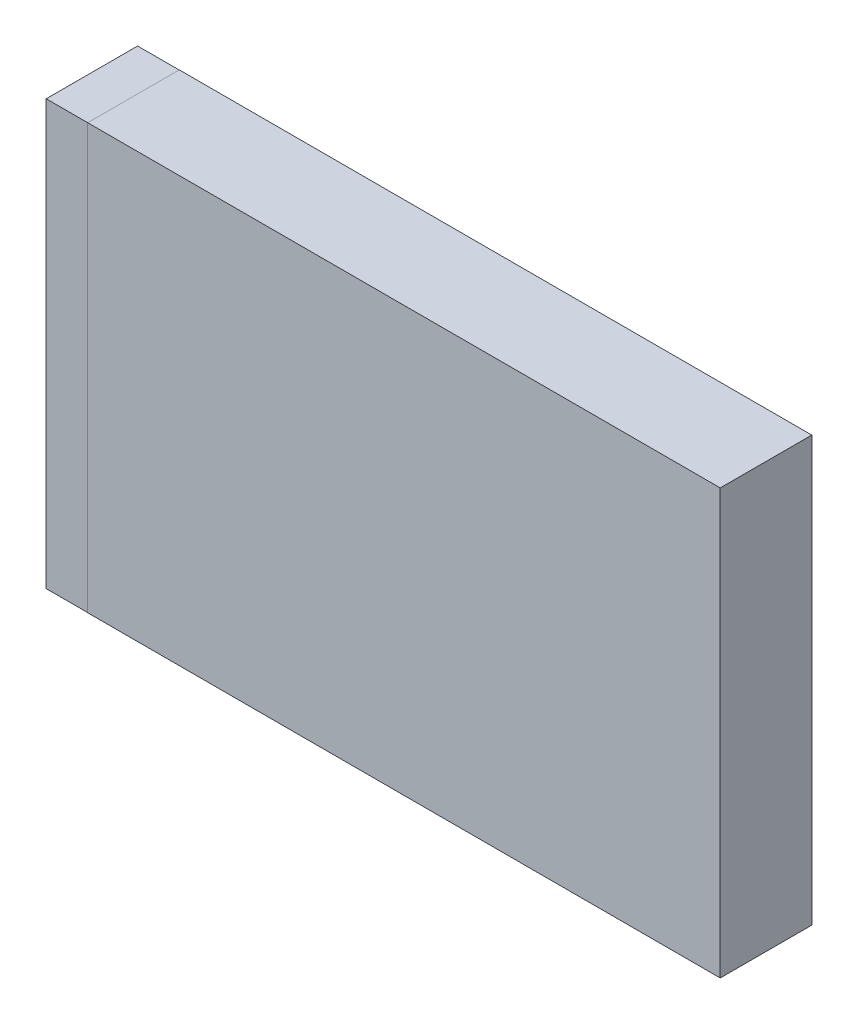
ISO-10303-21;
HEADER;
FILE_DESCRIPTION(('STEP AP214'),'2;1');
FILE_NAME('part.step','',(''),(''),'','','');
FILE_SCHEMA(('AUTOMOTIVE_DESIGN { 1 0 10303 214 1 1 1 1 }'));
ENDSEC;
DATA;
#1=APPLICATION_CONTEXT('core data for automotive mechanical design processes');
#2=APPLICATION_PROTOCOL_DEFINITION('international standard','automotive_design',2000,#1);
#3=PRODUCT_CONTEXT('',#1,'mechanical');
#4=PRODUCT('Part','Part','',(#3));
#5=PRODUCT_RELATED_PRODUCT_CATEGORY('part','',(#4));
#6=PRODUCT_DEFINITION_FORMATION('','',#4);
#7=PRODUCT_DEFINITION_CONTEXT('part definition',#1,'design');
#8=PRODUCT_DEFINITION('design','',#6,#7);
#9=PRODUCT_DEFINITION_SHAPE('','',#8);
#10=(LENGTH_UNIT() NAMED_UNIT(*) SI_UNIT(.MILLI.,.METRE.));
#11=(NAMED_UNIT(*) PLANE_ANGLE_UNIT() SI_UNIT($,.RADIAN.));
#12=(NAMED_UNIT(*) SI_UNIT($,.STERADIAN.) SOLID_ANGLE_UNIT());
#13=UNCERTAINTY_MEASURE_WITH_UNIT(LENGTH_MEASURE(1.E-05),#10,'distance_accuracy_value','');
#14=(GEOMETRIC_REPRESENTATION_CONTEXT(3) GLOBAL_UNCERTAINTY_ASSIGNED_CONTEXT((#13)) GLOBAL_UNIT_ASSIGNED_CONTEXT((#10,
#11,#12)) REPRESENTATION_CONTEXT('',''));
#15=CARTESIAN_POINT('',(0.,0.,0.));
#16=DIRECTION('',(0.,0.,1.));
#17=DIRECTION('',(1.,0.,0.));
#18=AXIS2_PLACEMENT_3D('',#15,#16,#17);
#19=CARTESIAN_POINT('',(0.,0.,11.));
#20=DIRECTION('',(1.,0.,0.));
#21=DIRECTION('',(0.,0.,-1.));
#22=AXIS2_PLACEMENT_3D('',#19,#20,#21);
#23=PLANE('',#22);
#24=DIRECTION('',(0.,0.,1.));
#25=VECTOR('',#24,1.);
#26=CARTESIAN_POINT('',(0.,50.99,0.));
#27=LINE('',#26,#25);
#28=CARTESIAN_POINT('',(0.,50.99,0.01));
#29=VERTEX_POINT('',#28);
#30=CARTESIAN_POINT('',(0.,50.99,10.99));
#31=VERTEX_POINT('',#30);
#32=EDGE_CURVE('E96',#29,#31,#27,.T.);
#33=ORIENTED_EDGE('',*,*,#32,.F.);
#34=DIRECTION('',(0.,1.,0.));
#35=VECTOR('',#34,1.);
#36=CARTESIAN_POINT('',(0.,0.,0.01));
#37=LINE('',#36,#35);
#38=CARTESIAN_POINT('',(0.,0.01,0.01));
#39=VERTEX_POINT('',#38);
#40=EDGE_CURVE('E103',#39,#29,#37,.T.);
#41=ORIENTED_EDGE('',*,*,#40,.F.);
#42=DIRECTION('',(0.,0.,-1.));
#43=VECTOR('',#42,1.);
#44=CARTESIAN_POINT('',(0.,0.01,10.99));
#45=LINE('',#44,#43);
#46=CARTESIAN_POINT('',(0.,0.01,10.99));
#47=VERTEX_POINT('',#46);
#48=EDGE_CURVE('E110',#47,#39,#45,.T.);
#49=ORIENTED_EDGE('',*,*,#48,.F.);
#50=DIRECTION('',(0.,-1.,0.));
#51=VECTOR('',#50,1.);
#52=CARTESIAN_POINT('',(0.,51.,10.99));
#53=LINE('',#52,#51);
#54=EDGE_CURVE('E105',#31,#47,#53,.T.);
#55=ORIENTED_EDGE('',*,*,#54,.F.);
#56=EDGE_LOOP('',(#33,#41,#49,#55));
#57=FACE_BOUND('',#56,.T.);
#58=ADVANCED_FACE('F34',(#57),#23,.F.);
#59=CARTESIAN_POINT('',(0.,0.,10.99));
#60=DIRECTION('',(0.,0.,1.));
#61=DIRECTION('',(1.,0.,0.));
#62=AXIS2_PLACEMENT_3D('',#59,#60,#61);
#63=PLANE('',#62);
#64=DIRECTION('',(0.,1.,0.));
#65=VECTOR('',#64,1.);
#66=CARTESIAN_POINT('',(5.,51.,10.99));
#67=LINE('',#66,#65);
#68=CARTESIAN_POINT('',(5.,0.0100000000000031,10.99));
#69=VERTEX_POINT('',#68);
#70=CARTESIAN_POINT('',(5.,50.99,10.99));
#71=VERTEX_POINT('',#70);
#72=EDGE_CURVE('E125',#69,#71,#67,.T.);
#73=ORIENTED_EDGE('',*,*,#72,.T.);
#74=DIRECTION('',(-1.,0.,0.));
#75=VECTOR('',#74,1.);
#76=CARTESIAN_POINT('',(0.,50.99,10.99));
#77=LINE('',#76,#75);
#78=EDGE_CURVE('E108',#71,#31,#77,.T.);
#79=ORIENTED_EDGE('',*,*,#78,.T.);
#80=ORIENTED_EDGE('',*,*,#54,.T.);
#81=DIRECTION('',(-1.,0.,0.));
#82=VECTOR('',#81,1.);
#83=CARTESIAN_POINT('',(0.,0.01,10.99));
#84=LINE('',#83,#82);
#85=EDGE_CURVE('E118',#69,#47,#84,.T.);
#86=ORIENTED_EDGE('',*,*,#85,.F.);
#87=EDGE_LOOP('',(#73,#79,#80,#86));
#88=FACE_BOUND('',#87,.T.);
#89=ADVANCED_FACE('F161',(#88),#63,.T.);
#90=CARTESIAN_POINT('',(0.,0.,0.01));
#91=DIRECTION('',(0.,0.,-1.));
#92=DIRECTION('',(-1.,0.,0.));
#93=AXIS2_PLACEMENT_3D('',#90,#91,#92);
#94=PLANE('',#93);
#95=ORIENTED_EDGE('',*,*,#40,.T.);
#96=DIRECTION('',(1.,0.,0.));
#97=VECTOR('',#96,1.);
#98=CARTESIAN_POINT('',(0.,50.99,0.01));
#99=LINE('',#98,#97);
#100=CARTESIAN_POINT('',(5.,50.99,0.01));
#101=VERTEX_POINT('',#100);
#102=EDGE_CURVE('E11',#29,#101,#99,.T.);
#103=ORIENTED_EDGE('',*,*,#102,.T.);
#104=DIRECTION('',(0.,-1.,0.));
#105=VECTOR('',#104,1.);
#106=CARTESIAN_POINT('',(5.,0.,0.01));
#107=LINE('',#106,#105);
#108=CARTESIAN_POINT('',(5.,0.01,0.00999999999999959));
#109=VERTEX_POINT('',#108);
#110=EDGE_CURVE('E54',#101,#109,#107,.T.);
#111=ORIENTED_EDGE('',*,*,#110,.T.);
#112=DIRECTION('',(1.,0.,0.));
#113=VECTOR('',#112,1.);
#114=CARTESIAN_POINT('',(0.,0.01,0.01));
#115=LINE('',#114,#113);
#116=EDGE_CURVE('E41',#39,#109,#115,.T.);
#117=ORIENTED_EDGE('',*,*,#116,.F.);
#118=EDGE_LOOP('',(#95,#103,#111,#117));
#119=FACE_BOUND('',#118,.T.);
#120=ADVANCED_FACE('F107',(#119),#94,.T.);
#121=CARTESIAN_POINT('',(0.,0.01,0.));
#122=DIRECTION('',(0.,-1.,0.));
#123=DIRECTION('',(0.,0.,-1.));
#124=AXIS2_PLACEMENT_3D('',#121,#122,#123);
#125=PLANE('',#124);
#126=ORIENTED_EDGE('',*,*,#48,.T.);
#127=ORIENTED_EDGE('',*,*,#116,.T.);
#128=DIRECTION('',(0.,0.,1.));
#129=VECTOR('',#128,1.);
#130=CARTESIAN_POINT('',(5.,0.01,10.99));
#131=LINE('',#130,#129);
#132=EDGE_CURVE('E116',#109,#69,#131,.T.);
#133=ORIENTED_EDGE('',*,*,#132,.T.);
#134=ORIENTED_EDGE('',*,*,#85,.T.);
#135=EDGE_LOOP('',(#126,#127,#133,#134));
#136=FACE_BOUND('',#135,.T.);
#137=ADVANCED_FACE('F155',(#136),#125,.T.);
#138=CARTESIAN_POINT('',(0.,0.,11.));
#139=DIRECTION('',(0.,1.,0.));
#140=DIRECTION('',(0.,0.,1.));
#141=AXIS2_PLACEMENT_3D('',#138,#139,#140);
#142=PLANE('',#141);
#143=DIRECTION('',(0.,0.,1.));
#144=VECTOR('',#143,1.);
#145=CARTESIAN_POINT('',(5.,0.,10.99));
#146=LINE('',#145,#144);
#147=CARTESIAN_POINT('',(5.,0.,0.));
#148=VERTEX_POINT('',#147);
#149=CARTESIAN_POINT('',(5.,0.,11.));
#150=VERTEX_POINT('',#149);
#151=EDGE_CURVE('E128',#148,#150,#146,.T.);
#152=ORIENTED_EDGE('',*,*,#151,.F.);
#153=DIRECTION('',(1.,0.,0.));
#154=VECTOR('',#153,1.);
#155=CARTESIAN_POINT('',(0.,0.,0.));
#156=LINE('',#155,#154);
#157=CARTESIAN_POINT('',(81.,0.,0.));
#158=VERTEX_POINT('',#157);
#159=EDGE_CURVE('E133',#148,#158,#156,.T.);
#160=ORIENTED_EDGE('',*,*,#159,.T.);
#161=DIRECTION('',(0.,0.,-1.));
#162=VECTOR('',#161,1.);
#163=CARTESIAN_POINT('',(81.,0.,11.));
#164=LINE('',#163,#162);
#165=CARTESIAN_POINT('',(81.,0.,11.));
#166=VERTEX_POINT('',#165);
#167=EDGE_CURVE('E151',#166,#158,#164,.T.);
#168=ORIENTED_EDGE('',*,*,#167,.F.);
#169=DIRECTION('',(1.,0.,0.));
#170=VECTOR('',#169,1.);
#171=CARTESIAN_POINT('',(0.,0.,11.));
#172=LINE('',#171,#170);
#173=EDGE_CURVE('E135',#150,#166,#172,.T.);
#174=ORIENTED_EDGE('',*,*,#173,.F.);
#175=EDGE_LOOP('',(#152,#160,#168,#174));
#176=FACE_BOUND('',#175,.T.);
#177=ADVANCED_FACE('F188',(#176),#142,.F.);
#178=CARTESIAN_POINT('',(81.,0.,11.));
#179=DIRECTION('',(-1.,0.,0.));
#180=DIRECTION('',(0.,0.,1.));
#181=AXIS2_PLACEMENT_3D('',#178,#179,#180);
#182=PLANE('',#181);
#183=DIRECTION('',(0.,1.,0.));
#184=VECTOR('',#183,1.);
#185=CARTESIAN_POINT('',(81.,0.,0.));
#186=LINE('',#185,#184);
#187=CARTESIAN_POINT('',(81.,51.,0.));
#188=VERTEX_POINT('',#187);
#189=EDGE_CURVE('E145',#158,#188,#186,.T.);
#190=ORIENTED_EDGE('',*,*,#189,.T.);
#191=DIRECTION('',(0.,0.,-1.));
#192=VECTOR('',#191,1.);
#193=CARTESIAN_POINT('',(81.,51.,11.));
#194=LINE('',#193,#192);
#195=CARTESIAN_POINT('',(81.,51.,11.));
#196=VERTEX_POINT('',#195);
#197=EDGE_CURVE('E143',#196,#188,#194,.T.);
#198=ORIENTED_EDGE('',*,*,#197,.F.);
#199=DIRECTION('',(0.,1.,0.));
#200=VECTOR('',#199,1.);
#201=CARTESIAN_POINT('',(81.,0.,11.));
#202=LINE('',#201,#200);
#203=EDGE_CURVE('E137',#166,#196,#202,.T.);
#204=ORIENTED_EDGE('',*,*,#203,.F.);
#205=ORIENTED_EDGE('',*,*,#167,.T.);
#206=EDGE_LOOP('',(#190,#198,#204,#205));
#207=FACE_BOUND('',#206,.T.);
#208=ADVANCED_FACE('F185',(#207),#182,.F.);
#209=CARTESIAN_POINT('',(0.,51.,11.));
#210=DIRECTION('',(0.,-1.,0.));
#211=DIRECTION('',(0.,0.,-1.));
#212=AXIS2_PLACEMENT_3D('',#209,#210,#211);
#213=PLANE('',#212);
#214=DIRECTION('',(-1.,0.,0.));
#215=VECTOR('',#214,1.);
#216=CARTESIAN_POINT('',(0.,51.,0.));
#217=LINE('',#216,#215);
#218=CARTESIAN_POINT('',(5.,51.,0.));
#219=VERTEX_POINT('',#218);
#220=EDGE_CURVE('E138',#188,#219,#217,.T.);
#221=ORIENTED_EDGE('',*,*,#220,.T.);
#222=DIRECTION('',(0.,0.,1.));
#223=VECTOR('',#222,1.);
#224=CARTESIAN_POINT('',(5.,51.,10.99));
#225=LINE('',#224,#223);
#226=CARTESIAN_POINT('',(5.,51.,11.));
#227=VERTEX_POINT('',#226);
#228=EDGE_CURVE('E130',#219,#227,#225,.T.);
#229=ORIENTED_EDGE('',*,*,#228,.T.);
#230=DIRECTION('',(-1.,0.,0.));
#231=VECTOR('',#230,1.);
#232=CARTESIAN_POINT('',(0.,51.,11.));
#233=LINE('',#232,#231);
#234=EDGE_CURVE('E140',#196,#227,#233,.T.);
#235=ORIENTED_EDGE('',*,*,#234,.F.);
#236=ORIENTED_EDGE('',*,*,#197,.T.);
#237=EDGE_LOOP('',(#221,#229,#235,#236));
#238=FACE_BOUND('',#237,.T.);
#239=ADVANCED_FACE('F178',(#238),#213,.F.);
#240=CARTESIAN_POINT('',(0.,0.,11.));
#241=DIRECTION('',(0.,0.,-1.));
#242=DIRECTION('',(-1.,0.,0.));
#243=AXIS2_PLACEMENT_3D('',#240,#241,#242);
#244=PLANE('',#243);
#245=ORIENTED_EDGE('',*,*,#234,.T.);
#246=DIRECTION('',(0.,1.,0.));
#247=VECTOR('',#246,1.);
#248=CARTESIAN_POINT('',(5.,51.,11.));
#249=LINE('',#248,#247);
#250=EDGE_CURVE('E123',#150,#227,#249,.T.);
#251=ORIENTED_EDGE('',*,*,#250,.F.);
#252=ORIENTED_EDGE('',*,*,#173,.T.);
#253=ORIENTED_EDGE('',*,*,#203,.T.);
#254=EDGE_LOOP('',(#245,#251,#252,#253));
#255=FACE_BOUND('',#254,.T.);
#256=ADVANCED_FACE('F175',(#255),#244,.F.);
#257=CARTESIAN_POINT('',(0.,0.,0.));
#258=DIRECTION('',(0.,0.,-1.));
#259=DIRECTION('',(-1.,0.,0.));
#260=AXIS2_PLACEMENT_3D('',#257,#258,#259);
#261=PLANE('',#260);
#262=DIRECTION('',(0.,-1.,0.));
#263=VECTOR('',#262,1.);
#264=CARTESIAN_POINT('',(5.,0.01,0.));
#265=LINE('',#264,#263);
#266=EDGE_CURVE('E121',#219,#148,#265,.T.);
#267=ORIENTED_EDGE('',*,*,#266,.F.);
#268=ORIENTED_EDGE('',*,*,#220,.F.);
#269=ORIENTED_EDGE('',*,*,#189,.F.);
#270=ORIENTED_EDGE('',*,*,#159,.F.);
#271=EDGE_LOOP('',(#267,#268,#269,#270));
#272=FACE_BOUND('',#271,.T.);
#273=ADVANCED_FACE('F173',(#272),#261,.T.);
#274=CARTESIAN_POINT('',(5.,51.,10.99));
#275=DIRECTION('',(1.,0.,0.));
#276=DIRECTION('',(0.,1.,0.));
#277=AXIS2_PLACEMENT_3D('',#274,#275,#276);
#278=PLANE('',#277);
#279=ORIENTED_EDGE('',*,*,#228,.F.);
#280=ORIENTED_EDGE('',*,*,#266,.T.);
#281=ORIENTED_EDGE('',*,*,#151,.T.);
#282=ORIENTED_EDGE('',*,*,#250,.T.);
#283=EDGE_LOOP('',(#279,#280,#281,#282));
#284=FACE_BOUND('',#283,.T.);
#285=DIRECTION('',(0.,0.,-1.));
#286=VECTOR('',#285,1.);
#287=CARTESIAN_POINT('',(5.,50.99,0.));
#288=LINE('',#287,#286);
#289=EDGE_CURVE('E48',#71,#101,#288,.T.);
#290=ORIENTED_EDGE('',*,*,#289,.F.);
#291=ORIENTED_EDGE('',*,*,#72,.F.);
#292=ORIENTED_EDGE('',*,*,#132,.F.);
#293=ORIENTED_EDGE('',*,*,#110,.F.);
#294=EDGE_LOOP('',(#290,#291,#292,#293));
#295=FACE_BOUND('',#294,.T.);
#296=ADVANCED_FACE('F159',(#284,#295),#278,.F.);
#297=CARTESIAN_POINT('',(0.,50.99,0.));
#298=DIRECTION('',(0.,1.,0.));
#299=DIRECTION('',(0.,0.,1.));
#300=AXIS2_PLACEMENT_3D('',#297,#298,#299);
#301=PLANE('',#300);
#302=ORIENTED_EDGE('',*,*,#289,.T.);
#303=ORIENTED_EDGE('',*,*,#102,.F.);
#304=ORIENTED_EDGE('',*,*,#32,.T.);
#305=ORIENTED_EDGE('',*,*,#78,.F.);
#306=EDGE_LOOP('',(#302,#303,#304,#305));
#307=FACE_BOUND('',#306,.T.);
#308=ADVANCED_FACE('F95',(#307),#301,.T.);
#309=CLOSED_SHELL('',(#58,#89,#120,#137,#177,#208,#239,#256,#273,#296,#308));
#310=MANIFOLD_SOLID_BREP('B2',#309);
#311=ADVANCED_BREP_SHAPE_REPRESENTATION('',(#18,#310),#14);
#312=SHAPE_DEFINITION_REPRESENTATION(#9,#311);
ENDSEC;
END-ISO-10303-21;
